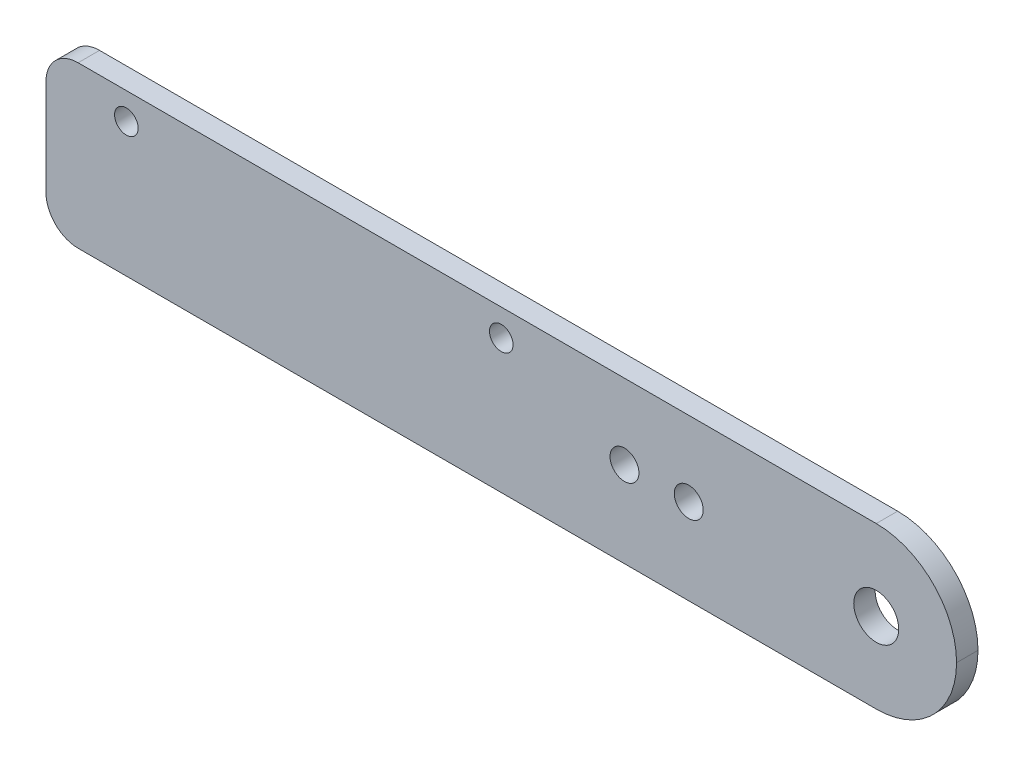
ISO-10303-21;
HEADER;
FILE_DESCRIPTION(('STEP AP214'),'2;1');
FILE_NAME('part.step','',(''),(''),'','','');
FILE_SCHEMA(('AUTOMOTIVE_DESIGN { 1 0 10303 214 1 1 1 1 }'));
ENDSEC;
DATA;
#1=APPLICATION_CONTEXT('core data for automotive mechanical design processes');
#2=APPLICATION_PROTOCOL_DEFINITION('international standard','automotive_design',2000,#1);
#3=PRODUCT_CONTEXT('',#1,'mechanical');
#4=PRODUCT('Part','Part','',(#3));
#5=PRODUCT_RELATED_PRODUCT_CATEGORY('part','',(#4));
#6=PRODUCT_DEFINITION_FORMATION('','',#4);
#7=PRODUCT_DEFINITION_CONTEXT('part definition',#1,'design');
#8=PRODUCT_DEFINITION('design','',#6,#7);
#9=PRODUCT_DEFINITION_SHAPE('','',#8);
#10=(LENGTH_UNIT() NAMED_UNIT(*) SI_UNIT(.MILLI.,.METRE.));
#11=(NAMED_UNIT(*) PLANE_ANGLE_UNIT() SI_UNIT($,.RADIAN.));
#12=(NAMED_UNIT(*) SI_UNIT($,.STERADIAN.) SOLID_ANGLE_UNIT());
#13=UNCERTAINTY_MEASURE_WITH_UNIT(LENGTH_MEASURE(1.E-05),#10,'distance_accuracy_value','');
#14=(GEOMETRIC_REPRESENTATION_CONTEXT(3) GLOBAL_UNCERTAINTY_ASSIGNED_CONTEXT((#13)) GLOBAL_UNIT_ASSIGNED_CONTEXT((#10,
#11,#12)) REPRESENTATION_CONTEXT('',''));
#15=CARTESIAN_POINT('',(0.,0.,0.));
#16=DIRECTION('',(0.,0.,1.));
#17=DIRECTION('',(1.,0.,0.));
#18=AXIS2_PLACEMENT_3D('',#15,#16,#17);
#19=CARTESIAN_POINT('',(-42.5,7.5,-2.));
#20=DIRECTION('',(0.,-1.,0.));
#21=DIRECTION('',(0.,0.,1.));
#22=AXIS2_PLACEMENT_3D('',#19,#20,#21);
#23=PLANE('',#22);
#24=DIRECTION('',(-1.,0.,0.));
#25=VECTOR('',#24,1.);
#26=CARTESIAN_POINT('',(-42.5,7.5,0.));
#27=LINE('',#26,#25);
#28=CARTESIAN_POINT('',(35.,7.5,0.));
#29=VERTEX_POINT('',#28);
#30=CARTESIAN_POINT('',(-39.5,7.5,0.));
#31=VERTEX_POINT('',#30);
#32=EDGE_CURVE('E100',#29,#31,#27,.T.);
#33=ORIENTED_EDGE('',*,*,#32,.F.);
#34=DIRECTION('',(0.,0.,1.));
#35=VECTOR('',#34,1.);
#36=CARTESIAN_POINT('',(35.,7.5,-2.));
#37=LINE('',#36,#35);
#38=CARTESIAN_POINT('',(35.,7.5,-2.));
#39=VERTEX_POINT('',#38);
#40=EDGE_CURVE('E106',#39,#29,#37,.T.);
#41=ORIENTED_EDGE('',*,*,#40,.F.);
#42=DIRECTION('',(-1.,0.,0.));
#43=VECTOR('',#42,1.);
#44=CARTESIAN_POINT('',(-42.5,7.5,-2.));
#45=LINE('',#44,#43);
#46=CARTESIAN_POINT('',(-39.5,7.5,-2.));
#47=VERTEX_POINT('',#46);
#48=EDGE_CURVE('E126',#39,#47,#45,.T.);
#49=ORIENTED_EDGE('',*,*,#48,.T.);
#50=DIRECTION('',(0.,0.,1.));
#51=VECTOR('',#50,1.);
#52=CARTESIAN_POINT('',(-39.5,7.5,-2.));
#53=LINE('',#52,#51);
#54=EDGE_CURVE('E11',#31,#47,#53,.F.);
#55=ORIENTED_EDGE('',*,*,#54,.F.);
#56=EDGE_LOOP('',(#33,#41,#49,#55));
#57=FACE_BOUND('',#56,.T.);
#58=ADVANCED_FACE('F37',(#57),#23,.F.);
#59=CARTESIAN_POINT('',(-42.5,-7.5,-2.));
#60=DIRECTION('',(1.,0.,0.));
#61=DIRECTION('',(0.,0.,1.));
#62=AXIS2_PLACEMENT_3D('',#59,#60,#61);
#63=PLANE('',#62);
#64=DIRECTION('',(0.,-1.,0.));
#65=VECTOR('',#64,1.);
#66=CARTESIAN_POINT('',(-42.5,-7.5,0.));
#67=LINE('',#66,#65);
#68=CARTESIAN_POINT('',(-42.5,4.5,0.));
#69=VERTEX_POINT('',#68);
#70=CARTESIAN_POINT('',(-42.5,-4.5,0.));
#71=VERTEX_POINT('',#70);
#72=EDGE_CURVE('E115',#69,#71,#67,.T.);
#73=ORIENTED_EDGE('',*,*,#72,.F.);
#74=DIRECTION('',(0.,0.,1.));
#75=VECTOR('',#74,1.);
#76=CARTESIAN_POINT('',(-42.5,4.5,-2.));
#77=LINE('',#76,#75);
#78=CARTESIAN_POINT('',(-42.5,4.5,-2.));
#79=VERTEX_POINT('',#78);
#80=EDGE_CURVE('E161',#79,#69,#77,.T.);
#81=ORIENTED_EDGE('',*,*,#80,.F.);
#82=DIRECTION('',(0.,-1.,0.));
#83=VECTOR('',#82,1.);
#84=CARTESIAN_POINT('',(-42.5,-7.5,-2.));
#85=LINE('',#84,#83);
#86=CARTESIAN_POINT('',(-42.5,-4.5,-2.));
#87=VERTEX_POINT('',#86);
#88=EDGE_CURVE('E177',#79,#87,#85,.T.);
#89=ORIENTED_EDGE('',*,*,#88,.T.);
#90=DIRECTION('',(0.,0.,1.));
#91=VECTOR('',#90,1.);
#92=CARTESIAN_POINT('',(-42.5,-4.5,-2.));
#93=LINE('',#92,#91);
#94=EDGE_CURVE('E164',#71,#87,#93,.F.);
#95=ORIENTED_EDGE('',*,*,#94,.F.);
#96=EDGE_LOOP('',(#73,#81,#89,#95));
#97=FACE_BOUND('',#96,.T.);
#98=ADVANCED_FACE('F209',(#97),#63,.F.);
#99=CARTESIAN_POINT('',(-42.5,-7.5,-2.));
#100=DIRECTION('',(0.,1.,0.));
#101=DIRECTION('',(0.,0.,-1.));
#102=AXIS2_PLACEMENT_3D('',#99,#100,#101);
#103=PLANE('',#102);
#104=DIRECTION('',(1.,0.,0.));
#105=VECTOR('',#104,1.);
#106=CARTESIAN_POINT('',(-42.5,-7.5,-2.));
#107=LINE('',#106,#105);
#108=CARTESIAN_POINT('',(-39.5,-7.5,-2.));
#109=VERTEX_POINT('',#108);
#110=CARTESIAN_POINT('',(35.,-7.5,-2.));
#111=VERTEX_POINT('',#110);
#112=EDGE_CURVE('E112',#109,#111,#107,.T.);
#113=ORIENTED_EDGE('',*,*,#112,.T.);
#114=DIRECTION('',(0.,0.,1.));
#115=VECTOR('',#114,1.);
#116=CARTESIAN_POINT('',(35.,-7.5,-2.));
#117=LINE('',#116,#115);
#118=CARTESIAN_POINT('',(35.,-7.5,0.));
#119=VERTEX_POINT('',#118);
#120=EDGE_CURVE('E132',#119,#111,#117,.F.);
#121=ORIENTED_EDGE('',*,*,#120,.F.);
#122=DIRECTION('',(1.,0.,0.));
#123=VECTOR('',#122,1.);
#124=CARTESIAN_POINT('',(-42.5,-7.5,0.));
#125=LINE('',#124,#123);
#126=CARTESIAN_POINT('',(-39.5,-7.5,0.));
#127=VERTEX_POINT('',#126);
#128=EDGE_CURVE('E119',#127,#119,#125,.T.);
#129=ORIENTED_EDGE('',*,*,#128,.F.);
#130=DIRECTION('',(0.,0.,1.));
#131=VECTOR('',#130,1.);
#132=CARTESIAN_POINT('',(-39.5,-7.5,-2.));
#133=LINE('',#132,#131);
#134=EDGE_CURVE('E134',#109,#127,#133,.T.);
#135=ORIENTED_EDGE('',*,*,#134,.F.);
#136=EDGE_LOOP('',(#113,#121,#129,#135));
#137=FACE_BOUND('',#136,.T.);
#138=ADVANCED_FACE('F174',(#137),#103,.F.);
#139=CARTESIAN_POINT('',(0.,0.,-2.));
#140=DIRECTION('',(0.,0.,1.));
#141=DIRECTION('',(-1.,0.,0.));
#142=AXIS2_PLACEMENT_3D('',#139,#140,#141);
#143=PLANE('',#142);
#144=CARTESIAN_POINT('',(17.5,0.5,-2.));
#145=DIRECTION('',(0.,0.,1.));
#146=DIRECTION('',(1.,0.,0.));
#147=AXIS2_PLACEMENT_3D('',#144,#145,#146);
#148=CIRCLE('',#147,1.35000000000001);
#149=CARTESIAN_POINT('',(18.85,0.5,-2.));
#150=VERTEX_POINT('',#149);
#151=EDGE_CURVE('E154',#150,#150,#148,.T.);
#152=ORIENTED_EDGE('',*,*,#151,.T.);
#153=EDGE_LOOP('',(#152));
#154=FACE_BOUND('',#153,.T.);
#155=CARTESIAN_POINT('',(11.5,0.5,-2.));
#156=DIRECTION('',(0.,0.,1.));
#157=DIRECTION('',(1.,0.,0.));
#158=AXIS2_PLACEMENT_3D('',#155,#156,#157);
#159=CIRCLE('',#158,1.35);
#160=CARTESIAN_POINT('',(12.85,0.5,-2.));
#161=VERTEX_POINT('',#160);
#162=EDGE_CURVE('E150',#161,#161,#159,.T.);
#163=ORIENTED_EDGE('',*,*,#162,.T.);
#164=EDGE_LOOP('',(#163));
#165=FACE_BOUND('',#164,.T.);
#166=CARTESIAN_POINT('',(-35.,5.,-2.));
#167=DIRECTION('',(0.,0.,1.));
#168=DIRECTION('',(1.,0.,0.));
#169=AXIS2_PLACEMENT_3D('',#166,#167,#168);
#170=CIRCLE('',#169,1.1);
#171=CARTESIAN_POINT('',(-33.9,5.,-2.));
#172=VERTEX_POINT('',#171);
#173=EDGE_CURVE('E143',#172,#172,#170,.T.);
#174=ORIENTED_EDGE('',*,*,#173,.T.);
#175=EDGE_LOOP('',(#174));
#176=FACE_BOUND('',#175,.T.);
#177=CARTESIAN_POINT('',(0.,5.,-2.));
#178=DIRECTION('',(0.,0.,1.));
#179=DIRECTION('',(1.,0.,0.));
#180=AXIS2_PLACEMENT_3D('',#177,#178,#179);
#181=CIRCLE('',#180,1.1);
#182=CARTESIAN_POINT('',(1.1,5.,-2.));
#183=VERTEX_POINT('',#182);
#184=EDGE_CURVE('E149',#183,#183,#181,.T.);
#185=ORIENTED_EDGE('',*,*,#184,.T.);
#186=EDGE_LOOP('',(#185));
#187=FACE_BOUND('',#186,.T.);
#188=CARTESIAN_POINT('',(35.,0.,-2.));
#189=DIRECTION('',(0.,0.,1.));
#190=DIRECTION('',(1.,0.,0.));
#191=AXIS2_PLACEMENT_3D('',#188,#189,#190);
#192=CIRCLE('',#191,2.1);
#193=CARTESIAN_POINT('',(37.1,0.,-2.));
#194=VERTEX_POINT('',#193);
#195=EDGE_CURVE('E138',#194,#194,#192,.T.);
#196=ORIENTED_EDGE('',*,*,#195,.T.);
#197=EDGE_LOOP('',(#196));
#198=FACE_BOUND('',#197,.T.);
#199=ORIENTED_EDGE('',*,*,#88,.F.);
#200=CARTESIAN_POINT('',(-39.5,4.5,-2.));
#201=DIRECTION('',(0.,0.,-1.));
#202=DIRECTION('',(-1.,0.,0.));
#203=AXIS2_PLACEMENT_3D('',#200,#201,#202);
#204=CIRCLE('',#203,3.);
#205=EDGE_CURVE('E52',#47,#79,#204,.F.);
#206=ORIENTED_EDGE('',*,*,#205,.F.);
#207=ORIENTED_EDGE('',*,*,#48,.F.);
#208=CARTESIAN_POINT('',(35.,0.,-2.));
#209=DIRECTION('',(0.,0.,-1.));
#210=DIRECTION('',(-1.,0.,0.));
#211=AXIS2_PLACEMENT_3D('',#208,#209,#210);
#212=CIRCLE('',#211,7.5);
#213=CARTESIAN_POINT('',(42.5,0.,-2.));
#214=VERTEX_POINT('',#213);
#215=EDGE_CURVE('E109',#214,#39,#212,.F.);
#216=ORIENTED_EDGE('',*,*,#215,.F.);
#217=CARTESIAN_POINT('',(35.,0.,-2.));
#218=DIRECTION('',(0.,0.,-1.));
#219=DIRECTION('',(-1.,0.,0.));
#220=AXIS2_PLACEMENT_3D('',#217,#218,#219);
#221=CIRCLE('',#220,7.5);
#222=EDGE_CURVE('E103',#111,#214,#221,.F.);
#223=ORIENTED_EDGE('',*,*,#222,.F.);
#224=ORIENTED_EDGE('',*,*,#112,.F.);
#225=CARTESIAN_POINT('',(-39.5,-4.5,-2.));
#226=DIRECTION('',(0.,0.,-1.));
#227=DIRECTION('',(-1.,0.,0.));
#228=AXIS2_PLACEMENT_3D('',#225,#226,#227);
#229=CIRCLE('',#228,3.);
#230=EDGE_CURVE('E45',#87,#109,#229,.F.);
#231=ORIENTED_EDGE('',*,*,#230,.F.);
#232=EDGE_LOOP('',(#199,#206,#207,#216,#223,#224,#231));
#233=FACE_BOUND('',#232,.T.);
#234=ADVANCED_FACE('F176',(#154,#165,#176,#187,#198,#233),#143,.F.);
#235=CARTESIAN_POINT('',(0.,0.,0.));
#236=DIRECTION('',(0.,0.,1.));
#237=DIRECTION('',(-1.,0.,0.));
#238=AXIS2_PLACEMENT_3D('',#235,#236,#237);
#239=PLANE('',#238);
#240=CARTESIAN_POINT('',(17.5,0.5,0.));
#241=DIRECTION('',(0.,0.,-1.));
#242=DIRECTION('',(-1.,0.,0.));
#243=AXIS2_PLACEMENT_3D('',#240,#241,#242);
#244=CIRCLE('',#243,1.35000000000001);
#245=CARTESIAN_POINT('',(16.15,0.5,0.));
#246=VERTEX_POINT('',#245);
#247=EDGE_CURVE('E151',#246,#246,#244,.T.);
#248=ORIENTED_EDGE('',*,*,#247,.T.);
#249=EDGE_LOOP('',(#248));
#250=FACE_BOUND('',#249,.T.);
#251=CARTESIAN_POINT('',(11.5,0.5,0.));
#252=DIRECTION('',(0.,0.,-1.));
#253=DIRECTION('',(-1.,0.,0.));
#254=AXIS2_PLACEMENT_3D('',#251,#252,#253);
#255=CIRCLE('',#254,1.35);
#256=CARTESIAN_POINT('',(10.15,0.5,0.));
#257=VERTEX_POINT('',#256);
#258=EDGE_CURVE('E146',#257,#257,#255,.T.);
#259=ORIENTED_EDGE('',*,*,#258,.T.);
#260=EDGE_LOOP('',(#259));
#261=FACE_BOUND('',#260,.T.);
#262=CARTESIAN_POINT('',(-35.,5.,0.));
#263=DIRECTION('',(0.,0.,-1.));
#264=DIRECTION('',(-1.,0.,0.));
#265=AXIS2_PLACEMENT_3D('',#262,#263,#264);
#266=CIRCLE('',#265,1.1);
#267=CARTESIAN_POINT('',(-36.1,5.,0.));
#268=VERTEX_POINT('',#267);
#269=EDGE_CURVE('E142',#268,#268,#266,.T.);
#270=ORIENTED_EDGE('',*,*,#269,.T.);
#271=EDGE_LOOP('',(#270));
#272=FACE_BOUND('',#271,.T.);
#273=CARTESIAN_POINT('',(0.,5.,0.));
#274=DIRECTION('',(0.,0.,-1.));
#275=DIRECTION('',(-1.,0.,0.));
#276=AXIS2_PLACEMENT_3D('',#273,#274,#275);
#277=CIRCLE('',#276,1.1);
#278=CARTESIAN_POINT('',(-1.1,5.,0.));
#279=VERTEX_POINT('',#278);
#280=EDGE_CURVE('E139',#279,#279,#277,.T.);
#281=ORIENTED_EDGE('',*,*,#280,.T.);
#282=EDGE_LOOP('',(#281));
#283=FACE_BOUND('',#282,.T.);
#284=CARTESIAN_POINT('',(35.,0.,0.));
#285=DIRECTION('',(0.,0.,-1.));
#286=DIRECTION('',(-1.,0.,0.));
#287=AXIS2_PLACEMENT_3D('',#284,#285,#286);
#288=CIRCLE('',#287,2.1);
#289=CARTESIAN_POINT('',(32.9,0.,0.));
#290=VERTEX_POINT('',#289);
#291=EDGE_CURVE('E121',#290,#290,#288,.T.);
#292=ORIENTED_EDGE('',*,*,#291,.T.);
#293=EDGE_LOOP('',(#292));
#294=FACE_BOUND('',#293,.T.);
#295=ORIENTED_EDGE('',*,*,#128,.T.);
#296=CARTESIAN_POINT('',(35.,0.,0.));
#297=DIRECTION('',(0.,0.,-1.));
#298=DIRECTION('',(-1.,0.,0.));
#299=AXIS2_PLACEMENT_3D('',#296,#297,#298);
#300=CIRCLE('',#299,7.5);
#301=CARTESIAN_POINT('',(42.5,0.,0.));
#302=VERTEX_POINT('',#301);
#303=EDGE_CURVE('E101',#302,#119,#300,.T.);
#304=ORIENTED_EDGE('',*,*,#303,.F.);
#305=CARTESIAN_POINT('',(35.,0.,0.));
#306=DIRECTION('',(0.,0.,-1.));
#307=DIRECTION('',(-1.,0.,0.));
#308=AXIS2_PLACEMENT_3D('',#305,#306,#307);
#309=CIRCLE('',#308,7.5);
#310=EDGE_CURVE('E95',#29,#302,#309,.T.);
#311=ORIENTED_EDGE('',*,*,#310,.F.);
#312=ORIENTED_EDGE('',*,*,#32,.T.);
#313=CARTESIAN_POINT('',(-39.5,4.5,0.));
#314=DIRECTION('',(0.,0.,-1.));
#315=DIRECTION('',(-1.,0.,0.));
#316=AXIS2_PLACEMENT_3D('',#313,#314,#315);
#317=CIRCLE('',#316,3.);
#318=EDGE_CURVE('E157',#69,#31,#317,.T.);
#319=ORIENTED_EDGE('',*,*,#318,.F.);
#320=ORIENTED_EDGE('',*,*,#72,.T.);
#321=CARTESIAN_POINT('',(-39.5,-4.5,0.));
#322=DIRECTION('',(0.,0.,-1.));
#323=DIRECTION('',(-1.,0.,0.));
#324=AXIS2_PLACEMENT_3D('',#321,#322,#323);
#325=CIRCLE('',#324,3.);
#326=EDGE_CURVE('E159',#127,#71,#325,.T.);
#327=ORIENTED_EDGE('',*,*,#326,.F.);
#328=EDGE_LOOP('',(#295,#304,#311,#312,#319,#320,#327));
#329=FACE_BOUND('',#328,.T.);
#330=ADVANCED_FACE('F98',(#250,#261,#272,#283,#294,#329),#239,.T.);
#331=CARTESIAN_POINT('',(35.,0.,-2.));
#332=DIRECTION('',(0.,0.,1.));
#333=DIRECTION('',(-1.,0.,0.));
#334=AXIS2_PLACEMENT_3D('',#331,#332,#333);
#335=CYLINDRICAL_SURFACE('',#334,7.5);
#336=DIRECTION('',(0.,0.,1.));
#337=VECTOR('',#336,1.);
#338=CARTESIAN_POINT('',(42.5,0.,-2.));
#339=LINE('',#338,#337);
#340=EDGE_CURVE('E116',#214,#302,#339,.T.);
#341=ORIENTED_EDGE('',*,*,#340,.T.);
#342=ORIENTED_EDGE('',*,*,#303,.T.);
#343=ORIENTED_EDGE('',*,*,#120,.T.);
#344=ORIENTED_EDGE('',*,*,#222,.T.);
#345=EDGE_LOOP('',(#341,#342,#343,#344));
#346=FACE_BOUND('',#345,.T.);
#347=ADVANCED_FACE('F220',(#346),#335,.T.);
#348=CARTESIAN_POINT('',(35.,0.,-2.));
#349=DIRECTION('',(0.,0.,1.));
#350=DIRECTION('',(-1.,0.,0.));
#351=AXIS2_PLACEMENT_3D('',#348,#349,#350);
#352=CYLINDRICAL_SURFACE('',#351,7.5);
#353=ORIENTED_EDGE('',*,*,#215,.T.);
#354=ORIENTED_EDGE('',*,*,#40,.T.);
#355=ORIENTED_EDGE('',*,*,#310,.T.);
#356=ORIENTED_EDGE('',*,*,#340,.F.);
#357=EDGE_LOOP('',(#353,#354,#355,#356));
#358=FACE_BOUND('',#357,.T.);
#359=ADVANCED_FACE('F107',(#358),#352,.T.);
#360=CARTESIAN_POINT('',(35.,0.,8.));
#361=DIRECTION('',(0.,0.,-1.));
#362=DIRECTION('',(1.,0.,0.));
#363=AXIS2_PLACEMENT_3D('',#360,#361,#362);
#364=CYLINDRICAL_SURFACE('',#363,2.1);
#365=ORIENTED_EDGE('',*,*,#291,.F.);
#366=EDGE_LOOP('',(#365));
#367=FACE_BOUND('',#366,.T.);
#368=ORIENTED_EDGE('',*,*,#195,.F.);
#369=EDGE_LOOP('',(#368));
#370=FACE_BOUND('',#369,.T.);
#371=ADVANCED_FACE('F219',(#367,#370),#364,.F.);
#372=CARTESIAN_POINT('',(0.,5.,8.));
#373=DIRECTION('',(0.,0.,-1.));
#374=DIRECTION('',(1.,0.,0.));
#375=AXIS2_PLACEMENT_3D('',#372,#373,#374);
#376=CYLINDRICAL_SURFACE('',#375,1.1);
#377=ORIENTED_EDGE('',*,*,#280,.F.);
#378=EDGE_LOOP('',(#377));
#379=FACE_BOUND('',#378,.T.);
#380=ORIENTED_EDGE('',*,*,#184,.F.);
#381=EDGE_LOOP('',(#380));
#382=FACE_BOUND('',#381,.T.);
#383=ADVANCED_FACE('F256',(#379,#382),#376,.F.);
#384=CARTESIAN_POINT('',(-35.,5.,8.));
#385=DIRECTION('',(0.,0.,-1.));
#386=DIRECTION('',(1.,0.,0.));
#387=AXIS2_PLACEMENT_3D('',#384,#385,#386);
#388=CYLINDRICAL_SURFACE('',#387,1.1);
#389=ORIENTED_EDGE('',*,*,#269,.F.);
#390=EDGE_LOOP('',(#389));
#391=FACE_BOUND('',#390,.T.);
#392=ORIENTED_EDGE('',*,*,#173,.F.);
#393=EDGE_LOOP('',(#392));
#394=FACE_BOUND('',#393,.T.);
#395=ADVANCED_FACE('F204',(#391,#394),#388,.F.);
#396=CARTESIAN_POINT('',(11.5,0.5,8.));
#397=DIRECTION('',(0.,0.,-1.));
#398=DIRECTION('',(1.,0.,0.));
#399=AXIS2_PLACEMENT_3D('',#396,#397,#398);
#400=CYLINDRICAL_SURFACE('',#399,1.35);
#401=ORIENTED_EDGE('',*,*,#258,.F.);
#402=EDGE_LOOP('',(#401));
#403=FACE_BOUND('',#402,.T.);
#404=ORIENTED_EDGE('',*,*,#162,.F.);
#405=EDGE_LOOP('',(#404));
#406=FACE_BOUND('',#405,.T.);
#407=ADVANCED_FACE('F197',(#403,#406),#400,.F.);
#408=CARTESIAN_POINT('',(17.5,0.5,8.));
#409=DIRECTION('',(0.,0.,-1.));
#410=DIRECTION('',(1.,0.,0.));
#411=AXIS2_PLACEMENT_3D('',#408,#409,#410);
#412=CYLINDRICAL_SURFACE('',#411,1.35000000000001);
#413=ORIENTED_EDGE('',*,*,#247,.F.);
#414=EDGE_LOOP('',(#413));
#415=FACE_BOUND('',#414,.T.);
#416=ORIENTED_EDGE('',*,*,#151,.F.);
#417=EDGE_LOOP('',(#416));
#418=FACE_BOUND('',#417,.T.);
#419=ADVANCED_FACE('F195',(#415,#418),#412,.F.);
#420=CARTESIAN_POINT('',(-39.5,-4.5,-2.));
#421=DIRECTION('',(0.,0.,1.));
#422=DIRECTION('',(-1.,0.,0.));
#423=AXIS2_PLACEMENT_3D('',#420,#421,#422);
#424=CYLINDRICAL_SURFACE('',#423,3.);
#425=ORIENTED_EDGE('',*,*,#230,.T.);
#426=ORIENTED_EDGE('',*,*,#134,.T.);
#427=ORIENTED_EDGE('',*,*,#326,.T.);
#428=ORIENTED_EDGE('',*,*,#94,.T.);
#429=EDGE_LOOP('',(#425,#426,#427,#428));
#430=FACE_BOUND('',#429,.T.);
#431=ADVANCED_FACE('F168',(#430),#424,.T.);
#432=CARTESIAN_POINT('',(-39.5,4.5,-2.));
#433=DIRECTION('',(0.,0.,1.));
#434=DIRECTION('',(-1.,0.,0.));
#435=AXIS2_PLACEMENT_3D('',#432,#433,#434);
#436=CYLINDRICAL_SURFACE('',#435,3.);
#437=ORIENTED_EDGE('',*,*,#205,.T.);
#438=ORIENTED_EDGE('',*,*,#80,.T.);
#439=ORIENTED_EDGE('',*,*,#318,.T.);
#440=ORIENTED_EDGE('',*,*,#54,.T.);
#441=EDGE_LOOP('',(#437,#438,#439,#440));
#442=FACE_BOUND('',#441,.T.);
#443=ADVANCED_FACE('F39',(#442),#436,.T.);
#444=CLOSED_SHELL('',(#58,#98,#138,#234,#330,#347,#359,#371,#383,#395,#407,#419,#431,#443));
#445=MANIFOLD_SOLID_BREP('B2',#444);
#446=ADVANCED_BREP_SHAPE_REPRESENTATION('',(#18,#445),#14);
#447=SHAPE_DEFINITION_REPRESENTATION(#9,#446);
ENDSEC;
END-ISO-10303-21;
